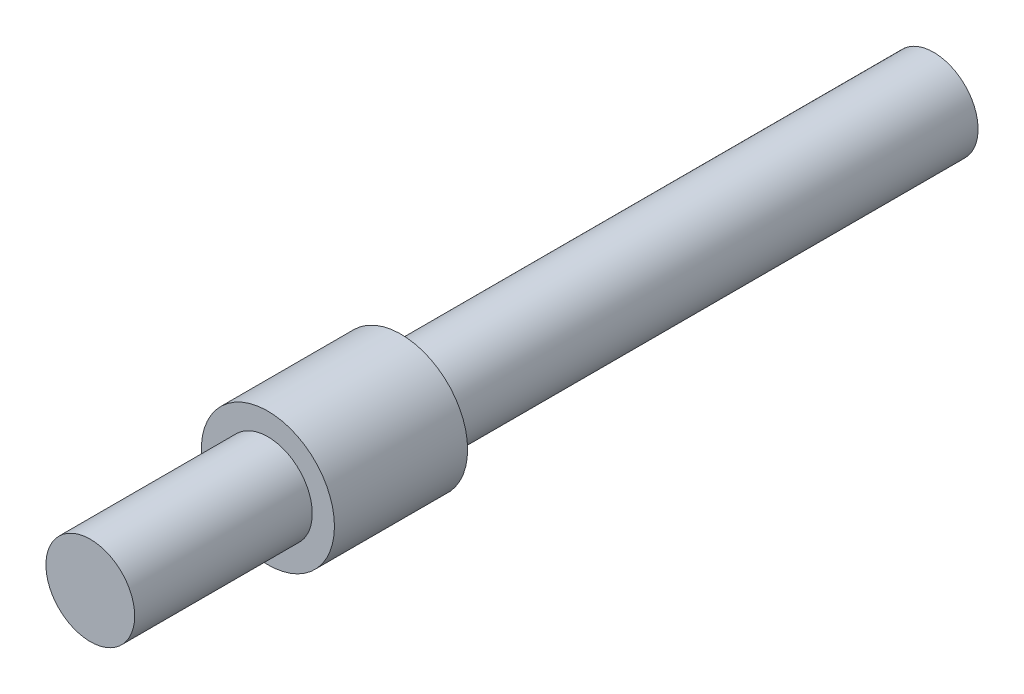
ISO-10303-21;
HEADER;
FILE_DESCRIPTION(('STEP AP214'),'2;1');
FILE_NAME('part.step','',(''),(''),'','','');
FILE_SCHEMA(('AUTOMOTIVE_DESIGN { 1 0 10303 214 1 1 1 1 }'));
ENDSEC;
DATA;
#1=APPLICATION_CONTEXT('core data for automotive mechanical design processes');
#2=APPLICATION_PROTOCOL_DEFINITION('international standard','automotive_design',2000,#1);
#3=PRODUCT_CONTEXT('',#1,'mechanical');
#4=PRODUCT('Part','Part','',(#3));
#5=PRODUCT_RELATED_PRODUCT_CATEGORY('part','',(#4));
#6=PRODUCT_DEFINITION_FORMATION('','',#4);
#7=PRODUCT_DEFINITION_CONTEXT('part definition',#1,'design');
#8=PRODUCT_DEFINITION('design','',#6,#7);
#9=PRODUCT_DEFINITION_SHAPE('','',#8);
#10=(LENGTH_UNIT() NAMED_UNIT(*) SI_UNIT(.MILLI.,.METRE.));
#11=(NAMED_UNIT(*) PLANE_ANGLE_UNIT() SI_UNIT($,.RADIAN.));
#12=(NAMED_UNIT(*) SI_UNIT($,.STERADIAN.) SOLID_ANGLE_UNIT());
#13=UNCERTAINTY_MEASURE_WITH_UNIT(LENGTH_MEASURE(1.E-05),#10,'distance_accuracy_value','');
#14=(GEOMETRIC_REPRESENTATION_CONTEXT(3) GLOBAL_UNCERTAINTY_ASSIGNED_CONTEXT((#13)) GLOBAL_UNIT_ASSIGNED_CONTEXT((#10,
#11,#12)) REPRESENTATION_CONTEXT('',''));
#15=CARTESIAN_POINT('',(0.,0.,0.));
#16=DIRECTION('',(0.,0.,1.));
#17=DIRECTION('',(1.,0.,0.));
#18=AXIS2_PLACEMENT_3D('',#15,#16,#17);
#19=CARTESIAN_POINT('',(0.,0.,1.51471862576143));
#20=DIRECTION('',(0.,0.,1.));
#21=DIRECTION('',(1.,0.,0.));
#22=AXIS2_PLACEMENT_3D('',#19,#20,#21);
#23=CYLINDRICAL_SURFACE('',#22,3.);
#24=CARTESIAN_POINT('',(0.,0.,10.));
#25=DIRECTION('',(0.,0.,-1.));
#26=DIRECTION('',(-1.,0.,0.));
#27=AXIS2_PLACEMENT_3D('',#24,#25,#26);
#28=CIRCLE('',#27,3.);
#29=CARTESIAN_POINT('',(3.,0.,10.));
#30=VERTEX_POINT('',#29);
#31=EDGE_CURVE('E56',#30,#30,#28,.F.);
#32=CARTESIAN_POINT('',(0.,0.,16.));
#33=DIRECTION('',(0.,0.,1.));
#34=DIRECTION('',(1.,0.,0.));
#35=AXIS2_PLACEMENT_3D('',#32,#33,#34);
#36=CIRCLE('',#35,3.);
#37=CARTESIAN_POINT('',(3.,0.,16.));
#38=VERTEX_POINT('',#37);
#39=EDGE_CURVE('E47',#38,#38,#36,.F.);
#40=CARTESIAN_POINT('',(3.,0.,10.));
#41=CARTESIAN_POINT('',(3.,0.,10.0625));
#42=CARTESIAN_POINT('',(3.,0.,10.125));
#43=CARTESIAN_POINT('',(3.,0.,10.25));
#44=CARTESIAN_POINT('',(3.,0.,10.3125));
#45=CARTESIAN_POINT('',(3.,0.,10.4375));
#46=CARTESIAN_POINT('',(3.,0.,10.5));
#47=CARTESIAN_POINT('',(3.,0.,10.625));
#48=CARTESIAN_POINT('',(3.,0.,10.6875));
#49=CARTESIAN_POINT('',(3.,0.,10.8125));
#50=CARTESIAN_POINT('',(3.,0.,10.875));
#51=CARTESIAN_POINT('',(3.,0.,11.));
#52=CARTESIAN_POINT('',(3.,0.,11.0625));
#53=CARTESIAN_POINT('',(3.,0.,11.1875));
#54=CARTESIAN_POINT('',(3.,0.,11.25));
#55=CARTESIAN_POINT('',(3.,0.,11.375));
#56=CARTESIAN_POINT('',(3.,0.,11.4375));
#57=CARTESIAN_POINT('',(3.,0.,11.5625));
#58=CARTESIAN_POINT('',(3.,0.,11.625));
#59=CARTESIAN_POINT('',(3.,0.,11.75));
#60=CARTESIAN_POINT('',(3.,0.,11.8125));
#61=CARTESIAN_POINT('',(3.,0.,11.9375));
#62=CARTESIAN_POINT('',(3.,0.,12.));
#63=CARTESIAN_POINT('',(3.,0.,12.125));
#64=CARTESIAN_POINT('',(3.,0.,12.1875));
#65=CARTESIAN_POINT('',(3.,0.,12.3125));
#66=CARTESIAN_POINT('',(3.,0.,12.375));
#67=CARTESIAN_POINT('',(3.,0.,12.5));
#68=CARTESIAN_POINT('',(3.,0.,12.5625));
#69=CARTESIAN_POINT('',(3.,0.,12.6875));
#70=CARTESIAN_POINT('',(3.,0.,12.75));
#71=CARTESIAN_POINT('',(3.,0.,12.875));
#72=CARTESIAN_POINT('',(3.,0.,12.9375));
#73=CARTESIAN_POINT('',(3.,0.,13.0625));
#74=CARTESIAN_POINT('',(3.,0.,13.125));
#75=CARTESIAN_POINT('',(3.,0.,13.25));
#76=CARTESIAN_POINT('',(3.,0.,13.3125));
#77=CARTESIAN_POINT('',(3.,0.,13.4375));
#78=CARTESIAN_POINT('',(3.,0.,13.5));
#79=CARTESIAN_POINT('',(3.,0.,13.625));
#80=CARTESIAN_POINT('',(3.,0.,13.6875));
#81=CARTESIAN_POINT('',(3.,0.,13.8125));
#82=CARTESIAN_POINT('',(3.,0.,13.875));
#83=CARTESIAN_POINT('',(3.,0.,14.));
#84=CARTESIAN_POINT('',(3.,0.,14.0625));
#85=CARTESIAN_POINT('',(3.,0.,14.1875));
#86=CARTESIAN_POINT('',(3.,0.,14.25));
#87=CARTESIAN_POINT('',(3.,0.,14.375));
#88=CARTESIAN_POINT('',(3.,0.,14.4375));
#89=CARTESIAN_POINT('',(3.,0.,14.5625));
#90=CARTESIAN_POINT('',(3.,0.,14.625));
#91=CARTESIAN_POINT('',(3.,0.,14.75));
#92=CARTESIAN_POINT('',(3.,0.,14.8125));
#93=CARTESIAN_POINT('',(3.,0.,14.9375));
#94=CARTESIAN_POINT('',(3.,0.,15.));
#95=CARTESIAN_POINT('',(3.,0.,15.125));
#96=CARTESIAN_POINT('',(3.,0.,15.1875));
#97=CARTESIAN_POINT('',(3.,0.,15.3125));
#98=CARTESIAN_POINT('',(3.,0.,15.375));
#99=CARTESIAN_POINT('',(3.,0.,15.5));
#100=CARTESIAN_POINT('',(3.,0.,15.5625));
#101=CARTESIAN_POINT('',(3.,0.,15.6875));
#102=CARTESIAN_POINT('',(3.,0.,15.75));
#103=CARTESIAN_POINT('',(3.,0.,15.875));
#104=CARTESIAN_POINT('',(3.,0.,15.9375));
#105=CARTESIAN_POINT('',(3.,0.,16.));
#106=B_SPLINE_CURVE_WITH_KNOTS('',3,(#40,#41,#42,#43,#44,#45,#46,#47,#48,#49,#50,#51,#52,#53,
#54,#55,#56,#57,#58,#59,#60,#61,#62,#63,#64,#65,#66,#67,#68,#69,#70,#71,#72,#73,#74,#75,#76,#77,
#78,#79,#80,#81,#82,#83,#84,#85,#86,#87,#88,#89,#90,#91,#92,#93,#94,#95,#96,#97,#98,#99,#100,
#101,#102,#103,#104,#105),.UNSPECIFIED.,.F.,.F.,(4,2,2,2,2,2,2,2,2,2,2,2,2,2,2,2,2,2,2,2,2,2,2,
2,2,2,2,2,2,2,2,2,4),(0.,0.1875,0.375,0.5625,0.750000000000001,0.937499999999999,1.125,1.3125,
1.5,1.6875,1.875,2.0625,2.25,2.4375,2.625,2.8125,3.,3.1875,3.375,3.5625,3.75,3.9375,4.125,
4.3125,4.5,4.6875,4.875,5.0625,5.25,5.4375,5.625,5.8125,6.),.UNSPECIFIED.);
#107=EDGE_CURVE('BSEAM43',#30,#38,#106,.T.);
#108=ORIENTED_EDGE('',*,*,#31,.T.);
#109=ORIENTED_EDGE('',*,*,#39,.T.);
#110=ORIENTED_EDGE('',*,*,#107,.T.);
#111=ORIENTED_EDGE('',*,*,#107,.F.);
#112=EDGE_LOOP('',(#108,#110,#109,#111));
#113=FACE_BOUND('',#112,.T.);
#114=ADVANCED_FACE('F43',(#113),#23,.T.);
#115=CARTESIAN_POINT('',(0.,0.,24.));
#116=DIRECTION('',(0.,0.,-1.));
#117=DIRECTION('',(-1.,0.,0.));
#118=AXIS2_PLACEMENT_3D('',#115,#116,#117);
#119=CYLINDRICAL_SURFACE('',#118,2.);
#120=CARTESIAN_POINT('',(0.,0.,10.));
#121=DIRECTION('',(0.,0.,-1.));
#122=DIRECTION('',(-1.,0.,0.));
#123=AXIS2_PLACEMENT_3D('',#120,#121,#122);
#124=CIRCLE('',#123,2.);
#125=CARTESIAN_POINT('',(-2.,0.,10.));
#126=VERTEX_POINT('',#125);
#127=EDGE_CURVE('E51',#126,#126,#124,.T.);
#128=ORIENTED_EDGE('',*,*,#127,.T.);
#129=EDGE_LOOP('',(#128));
#130=FACE_BOUND('',#129,.T.);
#131=CARTESIAN_POINT('',(0.,0.,-14.));
#132=DIRECTION('',(0.,0.,-1.));
#133=DIRECTION('',(-1.,0.,0.));
#134=AXIS2_PLACEMENT_3D('',#131,#132,#133);
#135=CIRCLE('',#134,2.);
#136=CARTESIAN_POINT('',(-2.,0.,-14.));
#137=VERTEX_POINT('',#136);
#138=EDGE_CURVE('E60',#137,#137,#135,.T.);
#139=ORIENTED_EDGE('',*,*,#138,.F.);
#140=EDGE_LOOP('',(#139));
#141=FACE_BOUND('',#140,.T.);
#142=ADVANCED_FACE('F85',(#130,#141),#119,.T.);
#143=CARTESIAN_POINT('',(0.,0.,10.));
#144=DIRECTION('',(0.,0.,-1.));
#145=DIRECTION('',(-1.,0.,0.));
#146=AXIS2_PLACEMENT_3D('',#143,#144,#145);
#147=PLANE('',#146);
#148=ORIENTED_EDGE('',*,*,#127,.F.);
#149=EDGE_LOOP('',(#148));
#150=FACE_BOUND('',#149,.T.);
#151=ORIENTED_EDGE('',*,*,#31,.F.);
#152=EDGE_LOOP('',(#151));
#153=FACE_BOUND('',#152,.T.);
#154=ADVANCED_FACE('F81',(#150,#153),#147,.T.);
#155=CARTESIAN_POINT('',(0.,0.,-14.));
#156=DIRECTION('',(0.,0.,-1.));
#157=DIRECTION('',(-1.,0.,0.));
#158=AXIS2_PLACEMENT_3D('',#155,#156,#157);
#159=PLANE('',#158);
#160=ORIENTED_EDGE('',*,*,#138,.T.);
#161=EDGE_LOOP('',(#160));
#162=FACE_BOUND('',#161,.T.);
#163=ADVANCED_FACE('F75',(#162),#159,.T.);
#164=CARTESIAN_POINT('',(0.,0.,16.));
#165=DIRECTION('',(0.,0.,1.));
#166=DIRECTION('',(1.,0.,0.));
#167=AXIS2_PLACEMENT_3D('',#164,#165,#166);
#168=PLANE('',#167);
#169=ORIENTED_EDGE('',*,*,#39,.F.);
#170=EDGE_LOOP('',(#169));
#171=FACE_BOUND('',#170,.T.);
#172=CARTESIAN_POINT('',(0.,0.,16.));
#173=DIRECTION('',(0.,0.,1.));
#174=DIRECTION('',(1.,0.,0.));
#175=AXIS2_PLACEMENT_3D('',#172,#173,#174);
#176=CIRCLE('',#175,2.);
#177=CARTESIAN_POINT('',(2.,0.,16.));
#178=VERTEX_POINT('',#177);
#179=EDGE_CURVE('E63',#178,#178,#176,.T.);
#180=ORIENTED_EDGE('',*,*,#179,.F.);
#181=EDGE_LOOP('',(#180));
#182=FACE_BOUND('',#181,.T.);
#183=ADVANCED_FACE('F71',(#171,#182),#168,.T.);
#184=CARTESIAN_POINT('',(0.,0.,24.));
#185=DIRECTION('',(0.,0.,1.));
#186=DIRECTION('',(1.,0.,0.));
#187=AXIS2_PLACEMENT_3D('',#184,#185,#186);
#188=PLANE('',#187);
#189=CARTESIAN_POINT('',(0.,0.,24.));
#190=DIRECTION('',(0.,0.,1.));
#191=DIRECTION('',(1.,0.,0.));
#192=AXIS2_PLACEMENT_3D('',#189,#190,#191);
#193=CIRCLE('',#192,2.);
#194=CARTESIAN_POINT('',(2.,0.,24.));
#195=VERTEX_POINT('',#194);
#196=EDGE_CURVE('E12',#195,#195,#193,.T.);
#197=ORIENTED_EDGE('',*,*,#196,.T.);
#198=EDGE_LOOP('',(#197));
#199=FACE_BOUND('',#198,.T.);
#200=ADVANCED_FACE('F74',(#199),#188,.T.);
#201=ORIENTED_EDGE('',*,*,#196,.F.);
#202=EDGE_LOOP('',(#201));
#203=FACE_BOUND('',#202,.T.);
#204=ORIENTED_EDGE('',*,*,#179,.T.);
#205=EDGE_LOOP('',(#204));
#206=FACE_BOUND('',#205,.T.);
#207=ADVANCED_FACE('F45',(#203,#206),#119,.T.);
#208=CLOSED_SHELL('',(#114,#142,#154,#163,#183,#200,#207));
#209=MANIFOLD_SOLID_BREP('B2',#208);
#210=ADVANCED_BREP_SHAPE_REPRESENTATION('',(#18,#209),#14);
#211=SHAPE_DEFINITION_REPRESENTATION(#9,#210);
ENDSEC;
END-ISO-10303-21;
